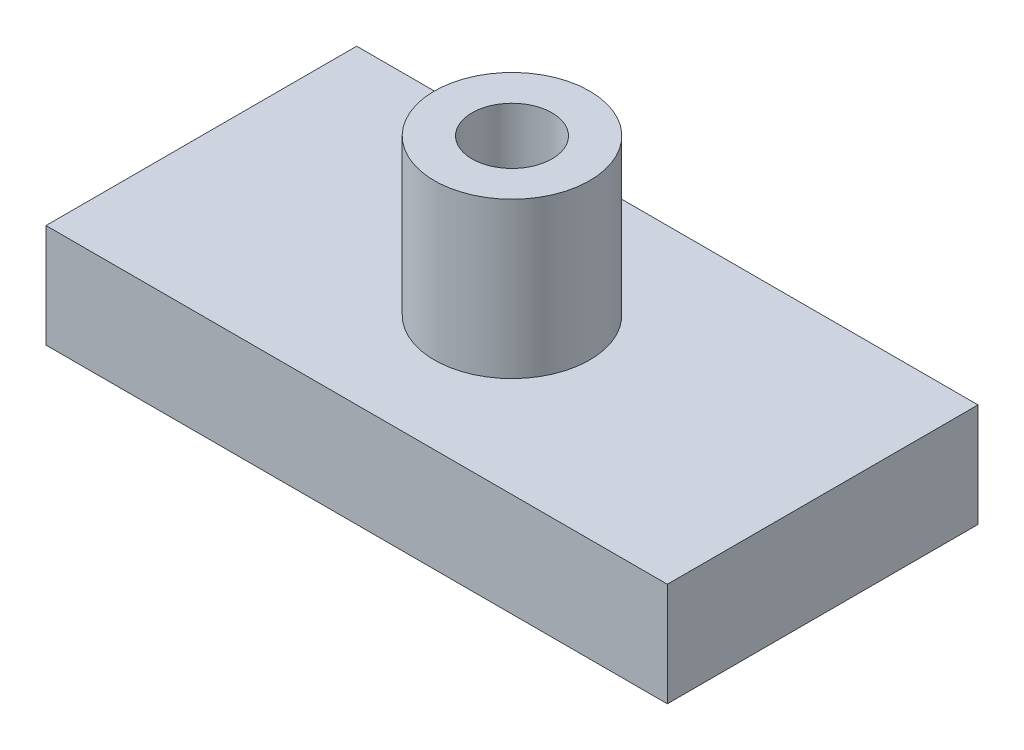
ISO-10303-21;
HEADER;
FILE_DESCRIPTION(('STEP AP214'),'2;1');
FILE_NAME('part.step','',(''),(''),'','','');
FILE_SCHEMA(('AUTOMOTIVE_DESIGN { 1 0 10303 214 1 1 1 1 }'));
ENDSEC;
DATA;
#1=APPLICATION_CONTEXT('core data for automotive mechanical design processes');
#2=APPLICATION_PROTOCOL_DEFINITION('international standard','automotive_design',2000,#1);
#3=PRODUCT_CONTEXT('',#1,'mechanical');
#4=PRODUCT('Part','Part','',(#3));
#5=PRODUCT_RELATED_PRODUCT_CATEGORY('part','',(#4));
#6=PRODUCT_DEFINITION_FORMATION('','',#4);
#7=PRODUCT_DEFINITION_CONTEXT('part definition',#1,'design');
#8=PRODUCT_DEFINITION('design','',#6,#7);
#9=PRODUCT_DEFINITION_SHAPE('','',#8);
#10=(LENGTH_UNIT() NAMED_UNIT(*) SI_UNIT(.MILLI.,.METRE.));
#11=(NAMED_UNIT(*) PLANE_ANGLE_UNIT() SI_UNIT($,.RADIAN.));
#12=(NAMED_UNIT(*) SI_UNIT($,.STERADIAN.) SOLID_ANGLE_UNIT());
#13=UNCERTAINTY_MEASURE_WITH_UNIT(LENGTH_MEASURE(1.E-05),#10,'distance_accuracy_value','');
#14=(GEOMETRIC_REPRESENTATION_CONTEXT(3) GLOBAL_UNCERTAINTY_ASSIGNED_CONTEXT((#13)) GLOBAL_UNIT_ASSIGNED_CONTEXT((#10,
#11,#12)) REPRESENTATION_CONTEXT('',''));
#15=CARTESIAN_POINT('',(0.,0.,0.));
#16=DIRECTION('',(0.,0.,1.));
#17=DIRECTION('',(1.,0.,0.));
#18=AXIS2_PLACEMENT_3D('',#15,#16,#17);
#19=CARTESIAN_POINT('',(0.,6.35,0.));
#20=DIRECTION('',(0.,-1.,0.));
#21=DIRECTION('',(0.,0.,-1.));
#22=AXIS2_PLACEMENT_3D('',#19,#20,#21);
#23=PLANE('',#22);
#24=DIRECTION('',(0.,0.,1.));
#25=VECTOR('',#24,1.);
#26=CARTESIAN_POINT('',(0.,6.35,0.));
#27=LINE('',#26,#25);
#28=CARTESIAN_POINT('',(0.,6.35,-19.05));
#29=VERTEX_POINT('',#28);
#30=CARTESIAN_POINT('',(0.,6.35,0.));
#31=VERTEX_POINT('',#30);
#32=EDGE_CURVE('E86',#29,#31,#27,.T.);
#33=ORIENTED_EDGE('',*,*,#32,.T.);
#34=DIRECTION('',(1.,0.,0.));
#35=VECTOR('',#34,1.);
#36=CARTESIAN_POINT('',(0.,6.35,0.));
#37=LINE('',#36,#35);
#38=CARTESIAN_POINT('',(38.1,6.35,0.));
#39=VERTEX_POINT('',#38);
#40=EDGE_CURVE('E81',#31,#39,#37,.T.);
#41=ORIENTED_EDGE('',*,*,#40,.T.);
#42=DIRECTION('',(0.,0.,-1.));
#43=VECTOR('',#42,1.);
#44=CARTESIAN_POINT('',(38.1,6.35,0.));
#45=LINE('',#44,#43);
#46=CARTESIAN_POINT('',(38.1,6.35,-19.05));
#47=VERTEX_POINT('',#46);
#48=EDGE_CURVE('E84',#39,#47,#45,.T.);
#49=ORIENTED_EDGE('',*,*,#48,.T.);
#50=DIRECTION('',(-1.,0.,0.));
#51=VECTOR('',#50,1.);
#52=CARTESIAN_POINT('',(0.,6.35,-19.05));
#53=LINE('',#52,#51);
#54=EDGE_CURVE('E50',#47,#29,#53,.T.);
#55=ORIENTED_EDGE('',*,*,#54,.T.);
#56=EDGE_LOOP('',(#33,#41,#49,#55));
#57=FACE_BOUND('',#56,.T.);
#58=CARTESIAN_POINT('',(19.05,6.35,-9.525));
#59=DIRECTION('',(0.,-1.,0.));
#60=DIRECTION('',(0.,0.,-1.));
#61=AXIS2_PLACEMENT_3D('',#58,#59,#60);
#62=CIRCLE('',#61,4.7625);
#63=CARTESIAN_POINT('',(19.05,6.35,-14.2875));
#64=VERTEX_POINT('',#63);
#65=EDGE_CURVE('E11',#64,#64,#62,.F.);
#66=ORIENTED_EDGE('',*,*,#65,.F.);
#67=EDGE_LOOP('',(#66));
#68=FACE_BOUND('',#67,.T.);
#69=ADVANCED_FACE('F33',(#57,#68),#23,.F.);
#70=CARTESIAN_POINT('',(0.,6.35,0.));
#71=DIRECTION('',(1.,0.,0.));
#72=DIRECTION('',(0.,0.,-1.));
#73=AXIS2_PLACEMENT_3D('',#70,#71,#72);
#74=PLANE('',#73);
#75=DIRECTION('',(0.,0.,1.));
#76=VECTOR('',#75,1.);
#77=CARTESIAN_POINT('',(0.,0.,0.));
#78=LINE('',#77,#76);
#79=CARTESIAN_POINT('',(0.,0.,-19.05));
#80=VERTEX_POINT('',#79);
#81=CARTESIAN_POINT('',(0.,0.,0.));
#82=VERTEX_POINT('',#81);
#83=EDGE_CURVE('E100',#80,#82,#78,.T.);
#84=ORIENTED_EDGE('',*,*,#83,.T.);
#85=DIRECTION('',(0.,-1.,0.));
#86=VECTOR('',#85,1.);
#87=CARTESIAN_POINT('',(0.,6.35,0.));
#88=LINE('',#87,#86);
#89=EDGE_CURVE('E42',#31,#82,#88,.T.);
#90=ORIENTED_EDGE('',*,*,#89,.F.);
#91=ORIENTED_EDGE('',*,*,#32,.F.);
#92=DIRECTION('',(0.,-1.,0.));
#93=VECTOR('',#92,1.);
#94=CARTESIAN_POINT('',(0.,6.35,-19.05));
#95=LINE('',#94,#93);
#96=EDGE_CURVE('E96',#29,#80,#95,.T.);
#97=ORIENTED_EDGE('',*,*,#96,.T.);
#98=EDGE_LOOP('',(#84,#90,#91,#97));
#99=FACE_BOUND('',#98,.T.);
#100=ADVANCED_FACE('F35',(#99),#74,.F.);
#101=CARTESIAN_POINT('',(0.,6.35,0.));
#102=DIRECTION('',(0.,0.,-1.));
#103=DIRECTION('',(-1.,0.,0.));
#104=AXIS2_PLACEMENT_3D('',#101,#102,#103);
#105=PLANE('',#104);
#106=DIRECTION('',(1.,0.,0.));
#107=VECTOR('',#106,1.);
#108=CARTESIAN_POINT('',(0.,0.,0.));
#109=LINE('',#108,#107);
#110=CARTESIAN_POINT('',(38.1,0.,0.));
#111=VERTEX_POINT('',#110);
#112=EDGE_CURVE('E91',#82,#111,#109,.T.);
#113=ORIENTED_EDGE('',*,*,#112,.T.);
#114=DIRECTION('',(0.,-1.,0.));
#115=VECTOR('',#114,1.);
#116=CARTESIAN_POINT('',(38.1,6.35,0.));
#117=LINE('',#116,#115);
#118=EDGE_CURVE('E89',#39,#111,#117,.T.);
#119=ORIENTED_EDGE('',*,*,#118,.F.);
#120=ORIENTED_EDGE('',*,*,#40,.F.);
#121=ORIENTED_EDGE('',*,*,#89,.T.);
#122=EDGE_LOOP('',(#113,#119,#120,#121));
#123=FACE_BOUND('',#122,.T.);
#124=ADVANCED_FACE('F90',(#123),#105,.F.);
#125=CARTESIAN_POINT('',(38.1,6.35,0.));
#126=DIRECTION('',(-1.,0.,0.));
#127=DIRECTION('',(0.,0.,1.));
#128=AXIS2_PLACEMENT_3D('',#125,#126,#127);
#129=PLANE('',#128);
#130=DIRECTION('',(0.,0.,-1.));
#131=VECTOR('',#130,1.);
#132=CARTESIAN_POINT('',(38.1,0.,0.));
#133=LINE('',#132,#131);
#134=CARTESIAN_POINT('',(38.1,0.,-19.05));
#135=VERTEX_POINT('',#134);
#136=EDGE_CURVE('E67',#111,#135,#133,.T.);
#137=ORIENTED_EDGE('',*,*,#136,.T.);
#138=DIRECTION('',(0.,-1.,0.));
#139=VECTOR('',#138,1.);
#140=CARTESIAN_POINT('',(38.1,6.35,-19.05));
#141=LINE('',#140,#139);
#142=EDGE_CURVE('E92',#47,#135,#141,.T.);
#143=ORIENTED_EDGE('',*,*,#142,.F.);
#144=ORIENTED_EDGE('',*,*,#48,.F.);
#145=ORIENTED_EDGE('',*,*,#118,.T.);
#146=EDGE_LOOP('',(#137,#143,#144,#145));
#147=FACE_BOUND('',#146,.T.);
#148=ADVANCED_FACE('F94',(#147),#129,.F.);
#149=CARTESIAN_POINT('',(0.,6.35,-19.05));
#150=DIRECTION('',(0.,0.,1.));
#151=DIRECTION('',(1.,0.,0.));
#152=AXIS2_PLACEMENT_3D('',#149,#150,#151);
#153=PLANE('',#152);
#154=DIRECTION('',(-1.,0.,0.));
#155=VECTOR('',#154,1.);
#156=CARTESIAN_POINT('',(0.,0.,-19.05));
#157=LINE('',#156,#155);
#158=EDGE_CURVE('E73',#135,#80,#157,.T.);
#159=ORIENTED_EDGE('',*,*,#158,.T.);
#160=ORIENTED_EDGE('',*,*,#96,.F.);
#161=ORIENTED_EDGE('',*,*,#54,.F.);
#162=ORIENTED_EDGE('',*,*,#142,.T.);
#163=EDGE_LOOP('',(#159,#160,#161,#162));
#164=FACE_BOUND('',#163,.T.);
#165=ADVANCED_FACE('F114',(#164),#153,.F.);
#166=CARTESIAN_POINT('',(0.,0.,0.));
#167=DIRECTION('',(0.,-1.,0.));
#168=DIRECTION('',(0.,0.,-1.));
#169=AXIS2_PLACEMENT_3D('',#166,#167,#168);
#170=PLANE('',#169);
#171=CARTESIAN_POINT('',(19.05,0.,-9.525));
#172=DIRECTION('',(0.,1.,0.));
#173=DIRECTION('',(0.,0.,1.));
#174=AXIS2_PLACEMENT_3D('',#171,#172,#173);
#175=CIRCLE('',#174,2.4511);
#176=CARTESIAN_POINT('',(19.05,0.,-7.0739));
#177=VERTEX_POINT('',#176);
#178=EDGE_CURVE('E142',#177,#177,#175,.T.);
#179=ORIENTED_EDGE('',*,*,#178,.T.);
#180=EDGE_LOOP('',(#179));
#181=FACE_BOUND('',#180,.T.);
#182=ORIENTED_EDGE('',*,*,#83,.F.);
#183=ORIENTED_EDGE('',*,*,#158,.F.);
#184=ORIENTED_EDGE('',*,*,#136,.F.);
#185=ORIENTED_EDGE('',*,*,#112,.F.);
#186=EDGE_LOOP('',(#182,#183,#184,#185));
#187=FACE_BOUND('',#186,.T.);
#188=ADVANCED_FACE('F111',(#181,#187),#170,.T.);
#189=CARTESIAN_POINT('',(19.05,15.875,-9.525));
#190=DIRECTION('',(0.,-1.,0.));
#191=DIRECTION('',(0.,0.,-1.));
#192=AXIS2_PLACEMENT_3D('',#189,#190,#191);
#193=CYLINDRICAL_SURFACE('',#192,4.7625);
#194=CARTESIAN_POINT('',(19.05,15.875,-9.525));
#195=DIRECTION('',(0.,1.,0.));
#196=DIRECTION('',(0.,0.,1.));
#197=AXIS2_PLACEMENT_3D('',#194,#195,#196);
#198=CIRCLE('',#197,4.7625);
#199=CARTESIAN_POINT('',(19.05,15.875,-14.2875));
#200=VERTEX_POINT('',#199);
#201=EDGE_CURVE('E103',#200,#200,#198,.T.);
#202=CARTESIAN_POINT('',(19.05,15.875,-14.2875));
#203=CARTESIAN_POINT('',(19.05,15.77578125,-14.2875));
#204=CARTESIAN_POINT('',(19.05,15.6765625,-14.2875));
#205=CARTESIAN_POINT('',(19.05,15.478125,-14.2875));
#206=CARTESIAN_POINT('',(19.05,15.37890625,-14.2875));
#207=CARTESIAN_POINT('',(19.05,15.18046875,-14.2875));
#208=CARTESIAN_POINT('',(19.05,15.08125,-14.2875));
#209=CARTESIAN_POINT('',(19.05,14.8828125,-14.2875));
#210=CARTESIAN_POINT('',(19.05,14.78359375,-14.2875));
#211=CARTESIAN_POINT('',(19.05,14.58515625,-14.2875));
#212=CARTESIAN_POINT('',(19.05,14.4859375,-14.2875));
#213=CARTESIAN_POINT('',(19.05,14.2875,-14.2875));
#214=CARTESIAN_POINT('',(19.05,14.18828125,-14.2875));
#215=CARTESIAN_POINT('',(19.05,13.98984375,-14.2875));
#216=CARTESIAN_POINT('',(19.05,13.890625,-14.2875));
#217=CARTESIAN_POINT('',(19.05,13.6921875,-14.2875));
#218=CARTESIAN_POINT('',(19.05,13.59296875,-14.2875));
#219=CARTESIAN_POINT('',(19.05,13.39453125,-14.2875));
#220=CARTESIAN_POINT('',(19.05,13.2953125,-14.2875));
#221=CARTESIAN_POINT('',(19.05,13.096875,-14.2875));
#222=CARTESIAN_POINT('',(19.05,12.99765625,-14.2875));
#223=CARTESIAN_POINT('',(19.05,12.79921875,-14.2875));
#224=CARTESIAN_POINT('',(19.05,12.7,-14.2875));
#225=CARTESIAN_POINT('',(19.05,12.5015625,-14.2875));
#226=CARTESIAN_POINT('',(19.05,12.40234375,-14.2875));
#227=CARTESIAN_POINT('',(19.05,12.20390625,-14.2875));
#228=CARTESIAN_POINT('',(19.05,12.1046875,-14.2875));
#229=CARTESIAN_POINT('',(19.05,11.90625,-14.2875));
#230=CARTESIAN_POINT('',(19.05,11.80703125,-14.2875));
#231=CARTESIAN_POINT('',(19.05,11.60859375,-14.2875));
#232=CARTESIAN_POINT('',(19.05,11.509375,-14.2875));
#233=CARTESIAN_POINT('',(19.05,11.3109375,-14.2875));
#234=CARTESIAN_POINT('',(19.05,11.21171875,-14.2875));
#235=CARTESIAN_POINT('',(19.05,11.01328125,-14.2875));
#236=CARTESIAN_POINT('',(19.05,10.9140625,-14.2875));
#237=CARTESIAN_POINT('',(19.05,10.715625,-14.2875));
#238=CARTESIAN_POINT('',(19.05,10.61640625,-14.2875));
#239=CARTESIAN_POINT('',(19.05,10.41796875,-14.2875));
#240=CARTESIAN_POINT('',(19.05,10.31875,-14.2875));
#241=CARTESIAN_POINT('',(19.05,10.1203125,-14.2875));
#242=CARTESIAN_POINT('',(19.05,10.02109375,-14.2875));
#243=CARTESIAN_POINT('',(19.05,9.82265625,-14.2875));
#244=CARTESIAN_POINT('',(19.05,9.7234375,-14.2875));
#245=CARTESIAN_POINT('',(19.05,9.525,-14.2875));
#246=CARTESIAN_POINT('',(19.05,9.42578125,-14.2875));
#247=CARTESIAN_POINT('',(19.05,9.22734375,-14.2875));
#248=CARTESIAN_POINT('',(19.05,9.128125,-14.2875));
#249=CARTESIAN_POINT('',(19.05,8.9296875,-14.2875));
#250=CARTESIAN_POINT('',(19.05,8.83046875,-14.2875));
#251=CARTESIAN_POINT('',(19.05,8.63203125,-14.2875));
#252=CARTESIAN_POINT('',(19.05,8.5328125,-14.2875));
#253=CARTESIAN_POINT('',(19.05,8.334375,-14.2875));
#254=CARTESIAN_POINT('',(19.05,8.23515625,-14.2875));
#255=CARTESIAN_POINT('',(19.05,8.03671875,-14.2875));
#256=CARTESIAN_POINT('',(19.05,7.9375,-14.2875));
#257=CARTESIAN_POINT('',(19.05,7.7390625,-14.2875));
#258=CARTESIAN_POINT('',(19.05,7.63984375,-14.2875));
#259=CARTESIAN_POINT('',(19.05,7.44140625,-14.2875));
#260=CARTESIAN_POINT('',(19.05,7.3421875,-14.2875));
#261=CARTESIAN_POINT('',(19.05,7.14375,-14.2875));
#262=CARTESIAN_POINT('',(19.05,7.04453125,-14.2875));
#263=CARTESIAN_POINT('',(19.05,6.84609375,-14.2875));
#264=CARTESIAN_POINT('',(19.05,6.746875,-14.2875));
#265=CARTESIAN_POINT('',(19.05,6.5484375,-14.2875));
#266=CARTESIAN_POINT('',(19.05,6.44921875,-14.2875));
#267=CARTESIAN_POINT('',(19.05,6.35,-14.2875));
#268=B_SPLINE_CURVE_WITH_KNOTS('',3,(#202,#203,#204,#205,#206,#207,#208,#209,#210,#211,#212,
#213,#214,#215,#216,#217,#218,#219,#220,#221,#222,#223,#224,#225,#226,#227,#228,#229,#230,#231,
#232,#233,#234,#235,#236,#237,#238,#239,#240,#241,#242,#243,#244,#245,#246,#247,#248,#249,#250,
#251,#252,#253,#254,#255,#256,#257,#258,#259,#260,#261,#262,#263,#264,#265,#266,#267),
.UNSPECIFIED.,.F.,.F.,(4,2,2,2,2,2,2,2,2,2,2,2,2,2,2,2,2,2,2,2,2,2,2,2,2,2,2,2,2,2,2,2,4),(0.,
0.297656250000002,0.595312500000002,0.892968750000002,1.190625,1.48828125,1.7859375,2.08359375,
2.38125,2.67890625,2.9765625,3.27421875,3.571875,3.86953125,4.1671875,4.46484375,4.7625,
5.06015625,5.3578125,5.65546875,5.953125,6.25078125,6.5484375,6.84609375,7.14375,7.44140625,
7.7390625,8.03671875,8.334375,8.63203125,8.9296875,9.22734375,9.525),.UNSPECIFIED.);
#269=EDGE_CURVE('BSEAM113',#200,#64,#268,.T.);
#270=ORIENTED_EDGE('',*,*,#201,.F.);
#271=ORIENTED_EDGE('',*,*,#65,.T.);
#272=ORIENTED_EDGE('',*,*,#269,.T.);
#273=ORIENTED_EDGE('',*,*,#269,.F.);
#274=EDGE_LOOP('',(#270,#272,#271,#273));
#275=FACE_BOUND('',#274,.T.);
#276=ADVANCED_FACE('F113',(#275),#193,.T.);
#277=CARTESIAN_POINT('',(19.05,15.875,-9.525));
#278=DIRECTION('',(0.,1.,0.));
#279=DIRECTION('',(0.,0.,1.));
#280=AXIS2_PLACEMENT_3D('',#277,#278,#279);
#281=PLANE('',#280);
#282=CARTESIAN_POINT('',(19.05,15.875,-9.525));
#283=DIRECTION('',(0.,1.,0.));
#284=DIRECTION('',(0.,0.,1.));
#285=AXIS2_PLACEMENT_3D('',#282,#283,#284);
#286=CIRCLE('',#285,2.4511);
#287=CARTESIAN_POINT('',(19.05,15.875,-7.0739));
#288=VERTEX_POINT('',#287);
#289=EDGE_CURVE('E145',#288,#288,#286,.T.);
#290=ORIENTED_EDGE('',*,*,#289,.F.);
#291=EDGE_LOOP('',(#290));
#292=FACE_BOUND('',#291,.T.);
#293=ORIENTED_EDGE('',*,*,#201,.T.);
#294=EDGE_LOOP('',(#293));
#295=FACE_BOUND('',#294,.T.);
#296=ADVANCED_FACE('F121',(#292,#295),#281,.T.);
#297=CARTESIAN_POINT('',(19.05,0.,-9.525));
#298=DIRECTION('',(0.,1.,0.));
#299=DIRECTION('',(0.,0.,1.));
#300=AXIS2_PLACEMENT_3D('',#297,#298,#299);
#301=CYLINDRICAL_SURFACE('',#300,2.4511);
#302=ORIENTED_EDGE('',*,*,#178,.F.);
#303=EDGE_LOOP('',(#302));
#304=FACE_BOUND('',#303,.T.);
#305=ORIENTED_EDGE('',*,*,#289,.T.);
#306=EDGE_LOOP('',(#305));
#307=FACE_BOUND('',#306,.T.);
#308=ADVANCED_FACE('F134',(#304,#307),#301,.F.);
#309=CLOSED_SHELL('',(#69,#100,#124,#148,#165,#188,#276,#296,#308));
#310=MANIFOLD_SOLID_BREP('B2',#309);
#311=ADVANCED_BREP_SHAPE_REPRESENTATION('',(#18,#310),#14);
#312=SHAPE_DEFINITION_REPRESENTATION(#9,#311);
ENDSEC;
END-ISO-10303-21;
